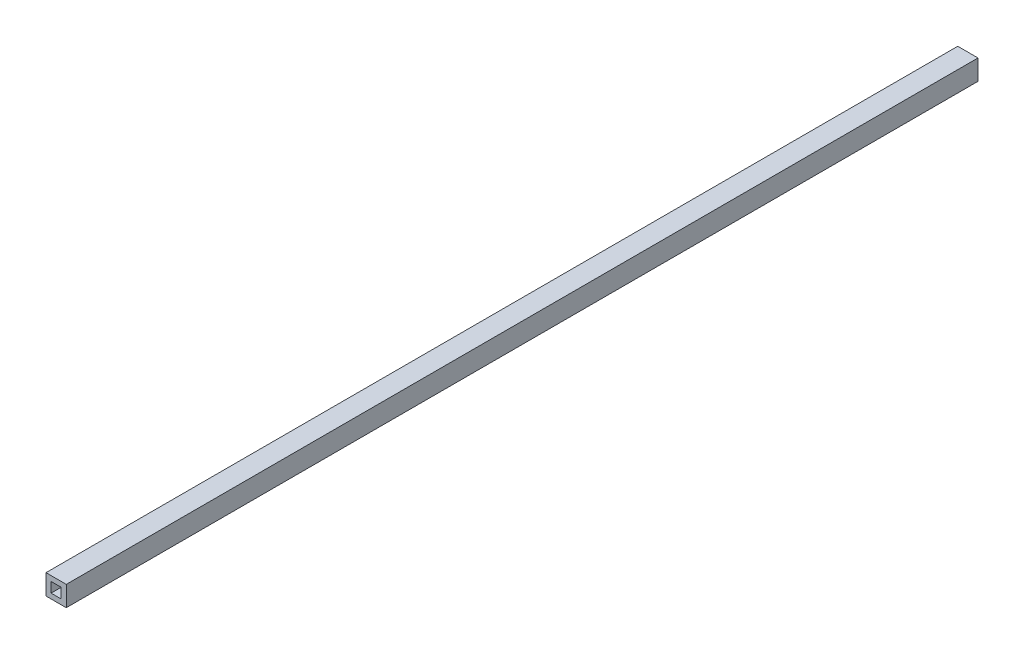
ISO-10303-21;
HEADER;
FILE_DESCRIPTION(('STEP AP214'),'2;1');
FILE_NAME('part.step','',(''),(''),'','','');
FILE_SCHEMA(('AUTOMOTIVE_DESIGN { 1 0 10303 214 1 1 1 1 }'));
ENDSEC;
DATA;
#1=APPLICATION_CONTEXT('core data for automotive mechanical design processes');
#2=APPLICATION_PROTOCOL_DEFINITION('international standard','automotive_design',2000,#1);
#3=PRODUCT_CONTEXT('',#1,'mechanical');
#4=PRODUCT('Part','Part','',(#3));
#5=PRODUCT_RELATED_PRODUCT_CATEGORY('part','',(#4));
#6=PRODUCT_DEFINITION_FORMATION('','',#4);
#7=PRODUCT_DEFINITION_CONTEXT('part definition',#1,'design');
#8=PRODUCT_DEFINITION('design','',#6,#7);
#9=PRODUCT_DEFINITION_SHAPE('','',#8);
#10=(LENGTH_UNIT() NAMED_UNIT(*) SI_UNIT(.MILLI.,.METRE.));
#11=(NAMED_UNIT(*) PLANE_ANGLE_UNIT() SI_UNIT($,.RADIAN.));
#12=(NAMED_UNIT(*) SI_UNIT($,.STERADIAN.) SOLID_ANGLE_UNIT());
#13=UNCERTAINTY_MEASURE_WITH_UNIT(LENGTH_MEASURE(1.E-05),#10,'distance_accuracy_value','');
#14=(GEOMETRIC_REPRESENTATION_CONTEXT(3) GLOBAL_UNCERTAINTY_ASSIGNED_CONTEXT((#13)) GLOBAL_UNIT_ASSIGNED_CONTEXT((#10,
#11,#12)) REPRESENTATION_CONTEXT('',''));
#15=CARTESIAN_POINT('',(0.,0.,0.));
#16=DIRECTION('',(0.,0.,1.));
#17=DIRECTION('',(1.,0.,0.));
#18=AXIS2_PLACEMENT_3D('',#15,#16,#17);
#19=CARTESIAN_POINT('',(0.,0.,900.));
#20=DIRECTION('',(0.,0.,1.));
#21=DIRECTION('',(1.,0.,0.));
#22=AXIS2_PLACEMENT_3D('',#19,#20,#21);
#23=PLANE('',#22);
#24=DIRECTION('',(0.,1.,0.));
#25=VECTOR('',#24,1.);
#26=CARTESIAN_POINT('',(10.,-10.,900.));
#27=LINE('',#26,#25);
#28=CARTESIAN_POINT('',(10.,-10.,900.));
#29=VERTEX_POINT('',#28);
#30=CARTESIAN_POINT('',(10.,10.,900.));
#31=VERTEX_POINT('',#30);
#32=EDGE_CURVE('E158',#29,#31,#27,.T.);
#33=ORIENTED_EDGE('',*,*,#32,.T.);
#34=DIRECTION('',(-1.,0.,0.));
#35=VECTOR('',#34,1.);
#36=CARTESIAN_POINT('',(-10.,10.,900.));
#37=LINE('',#36,#35);
#38=CARTESIAN_POINT('',(-10.,10.,900.));
#39=VERTEX_POINT('',#38);
#40=EDGE_CURVE('E161',#31,#39,#37,.T.);
#41=ORIENTED_EDGE('',*,*,#40,.T.);
#42=DIRECTION('',(0.,-1.,0.));
#43=VECTOR('',#42,1.);
#44=CARTESIAN_POINT('',(-10.,-10.,900.));
#45=LINE('',#44,#43);
#46=CARTESIAN_POINT('',(-10.,-10.,900.));
#47=VERTEX_POINT('',#46);
#48=EDGE_CURVE('E164',#39,#47,#45,.T.);
#49=ORIENTED_EDGE('',*,*,#48,.T.);
#50=DIRECTION('',(1.,0.,0.));
#51=VECTOR('',#50,1.);
#52=CARTESIAN_POINT('',(-10.,-10.,900.));
#53=LINE('',#52,#51);
#54=EDGE_CURVE('E166',#47,#29,#53,.T.);
#55=ORIENTED_EDGE('',*,*,#54,.T.);
#56=EDGE_LOOP('',(#33,#41,#49,#55));
#57=FACE_BOUND('',#56,.T.);
#58=DIRECTION('',(-1.,0.,0.));
#59=VECTOR('',#58,1.);
#60=CARTESIAN_POINT('',(0.,5.,900.));
#61=LINE('',#60,#59);
#62=CARTESIAN_POINT('',(5.,5.,900.));
#63=VERTEX_POINT('',#62);
#64=CARTESIAN_POINT('',(-5.,5.,900.));
#65=VERTEX_POINT('',#64);
#66=EDGE_CURVE('E130',#63,#65,#61,.T.);
#67=ORIENTED_EDGE('',*,*,#66,.F.);
#68=DIRECTION('',(0.,1.,0.));
#69=VECTOR('',#68,1.);
#70=CARTESIAN_POINT('',(5.,0.,900.));
#71=LINE('',#70,#69);
#72=CARTESIAN_POINT('',(5.,-5.,900.));
#73=VERTEX_POINT('',#72);
#74=EDGE_CURVE('E122',#73,#63,#71,.T.);
#75=ORIENTED_EDGE('',*,*,#74,.F.);
#76=DIRECTION('',(1.,0.,0.));
#77=VECTOR('',#76,1.);
#78=CARTESIAN_POINT('',(0.,-5.,900.));
#79=LINE('',#78,#77);
#80=CARTESIAN_POINT('',(-5.,-5.,900.));
#81=VERTEX_POINT('',#80);
#82=EDGE_CURVE('E144',#81,#73,#79,.T.);
#83=ORIENTED_EDGE('',*,*,#82,.F.);
#84=DIRECTION('',(0.,-1.,0.));
#85=VECTOR('',#84,1.);
#86=CARTESIAN_POINT('',(-5.,0.,900.));
#87=LINE('',#86,#85);
#88=EDGE_CURVE('E142',#65,#81,#87,.T.);
#89=ORIENTED_EDGE('',*,*,#88,.F.);
#90=EDGE_LOOP('',(#67,#75,#83,#89));
#91=FACE_BOUND('',#90,.T.);
#92=ADVANCED_FACE('F57',(#57,#91),#23,.T.);
#93=CARTESIAN_POINT('',(0.,0.,0.));
#94=DIRECTION('',(0.,0.,1.));
#95=DIRECTION('',(1.,0.,0.));
#96=AXIS2_PLACEMENT_3D('',#93,#94,#95);
#97=PLANE('',#96);
#98=DIRECTION('',(0.,1.,0.));
#99=VECTOR('',#98,1.);
#100=CARTESIAN_POINT('',(10.,-10.,0.));
#101=LINE('',#100,#99);
#102=CARTESIAN_POINT('',(10.,-10.,0.));
#103=VERTEX_POINT('',#102);
#104=CARTESIAN_POINT('',(10.,10.,0.));
#105=VERTEX_POINT('',#104);
#106=EDGE_CURVE('E138',#103,#105,#101,.T.);
#107=ORIENTED_EDGE('',*,*,#106,.F.);
#108=DIRECTION('',(1.,0.,0.));
#109=VECTOR('',#108,1.);
#110=CARTESIAN_POINT('',(-10.,-10.,0.));
#111=LINE('',#110,#109);
#112=CARTESIAN_POINT('',(-10.,-10.,0.));
#113=VERTEX_POINT('',#112);
#114=EDGE_CURVE('E162',#113,#103,#111,.T.);
#115=ORIENTED_EDGE('',*,*,#114,.F.);
#116=DIRECTION('',(0.,-1.,0.));
#117=VECTOR('',#116,1.);
#118=CARTESIAN_POINT('',(-10.,-10.,0.));
#119=LINE('',#118,#117);
#120=CARTESIAN_POINT('',(-10.,10.,0.));
#121=VERTEX_POINT('',#120);
#122=EDGE_CURVE('E173',#121,#113,#119,.T.);
#123=ORIENTED_EDGE('',*,*,#122,.F.);
#124=DIRECTION('',(-1.,0.,0.));
#125=VECTOR('',#124,1.);
#126=CARTESIAN_POINT('',(-10.,10.,0.));
#127=LINE('',#126,#125);
#128=EDGE_CURVE('E171',#105,#121,#127,.T.);
#129=ORIENTED_EDGE('',*,*,#128,.F.);
#130=EDGE_LOOP('',(#107,#115,#123,#129));
#131=FACE_BOUND('',#130,.T.);
#132=DIRECTION('',(0.,1.,0.));
#133=VECTOR('',#132,1.);
#134=CARTESIAN_POINT('',(5.,0.,0.));
#135=LINE('',#134,#133);
#136=CARTESIAN_POINT('',(5.,-5.,0.));
#137=VERTEX_POINT('',#136);
#138=CARTESIAN_POINT('',(5.,5.,0.));
#139=VERTEX_POINT('',#138);
#140=EDGE_CURVE('E80',#137,#139,#135,.T.);
#141=ORIENTED_EDGE('',*,*,#140,.T.);
#142=DIRECTION('',(-1.,0.,0.));
#143=VECTOR('',#142,1.);
#144=CARTESIAN_POINT('',(0.,5.,0.));
#145=LINE('',#144,#143);
#146=CARTESIAN_POINT('',(-5.,5.,0.));
#147=VERTEX_POINT('',#146);
#148=EDGE_CURVE('E137',#139,#147,#145,.T.);
#149=ORIENTED_EDGE('',*,*,#148,.T.);
#150=DIRECTION('',(0.,-1.,0.));
#151=VECTOR('',#150,1.);
#152=CARTESIAN_POINT('',(-5.,0.,0.));
#153=LINE('',#152,#151);
#154=CARTESIAN_POINT('',(-5.,-5.,0.));
#155=VERTEX_POINT('',#154);
#156=EDGE_CURVE('E150',#147,#155,#153,.T.);
#157=ORIENTED_EDGE('',*,*,#156,.T.);
#158=DIRECTION('',(1.,0.,0.));
#159=VECTOR('',#158,1.);
#160=CARTESIAN_POINT('',(0.,-5.,0.));
#161=LINE('',#160,#159);
#162=EDGE_CURVE('E131',#155,#137,#161,.T.);
#163=ORIENTED_EDGE('',*,*,#162,.T.);
#164=EDGE_LOOP('',(#141,#149,#157,#163));
#165=FACE_BOUND('',#164,.T.);
#166=ADVANCED_FACE('F191',(#131,#165),#97,.F.);
#167=CARTESIAN_POINT('',(10.,-10.,900.));
#168=DIRECTION('',(-1.,0.,0.));
#169=DIRECTION('',(0.,0.,1.));
#170=AXIS2_PLACEMENT_3D('',#167,#168,#169);
#171=PLANE('',#170);
#172=ORIENTED_EDGE('',*,*,#106,.T.);
#173=DIRECTION('',(0.,0.,-1.));
#174=VECTOR('',#173,1.);
#175=CARTESIAN_POINT('',(10.,10.,900.));
#176=LINE('',#175,#174);
#177=EDGE_CURVE('E12',#31,#105,#176,.T.);
#178=ORIENTED_EDGE('',*,*,#177,.F.);
#179=ORIENTED_EDGE('',*,*,#32,.F.);
#180=DIRECTION('',(0.,0.,-1.));
#181=VECTOR('',#180,1.);
#182=CARTESIAN_POINT('',(10.,-10.,900.));
#183=LINE('',#182,#181);
#184=EDGE_CURVE('E168',#29,#103,#183,.T.);
#185=ORIENTED_EDGE('',*,*,#184,.T.);
#186=EDGE_LOOP('',(#172,#178,#179,#185));
#187=FACE_BOUND('',#186,.T.);
#188=ADVANCED_FACE('F59',(#187),#171,.F.);
#189=CARTESIAN_POINT('',(-10.,10.,900.));
#190=DIRECTION('',(0.,-1.,0.));
#191=DIRECTION('',(0.,0.,-1.));
#192=AXIS2_PLACEMENT_3D('',#189,#190,#191);
#193=PLANE('',#192);
#194=ORIENTED_EDGE('',*,*,#128,.T.);
#195=DIRECTION('',(0.,0.,-1.));
#196=VECTOR('',#195,1.);
#197=CARTESIAN_POINT('',(-10.,10.,900.));
#198=LINE('',#197,#196);
#199=EDGE_CURVE('E65',#39,#121,#198,.T.);
#200=ORIENTED_EDGE('',*,*,#199,.F.);
#201=ORIENTED_EDGE('',*,*,#40,.F.);
#202=ORIENTED_EDGE('',*,*,#177,.T.);
#203=EDGE_LOOP('',(#194,#200,#201,#202));
#204=FACE_BOUND('',#203,.T.);
#205=ADVANCED_FACE('F201',(#204),#193,.F.);
#206=CARTESIAN_POINT('',(-10.,-10.,900.));
#207=DIRECTION('',(1.,0.,0.));
#208=DIRECTION('',(0.,0.,-1.));
#209=AXIS2_PLACEMENT_3D('',#206,#207,#208);
#210=PLANE('',#209);
#211=ORIENTED_EDGE('',*,*,#122,.T.);
#212=DIRECTION('',(0.,0.,-1.));
#213=VECTOR('',#212,1.);
#214=CARTESIAN_POINT('',(-10.,-10.,900.));
#215=LINE('',#214,#213);
#216=EDGE_CURVE('E178',#47,#113,#215,.T.);
#217=ORIENTED_EDGE('',*,*,#216,.F.);
#218=ORIENTED_EDGE('',*,*,#48,.F.);
#219=ORIENTED_EDGE('',*,*,#199,.T.);
#220=EDGE_LOOP('',(#211,#217,#218,#219));
#221=FACE_BOUND('',#220,.T.);
#222=ADVANCED_FACE('F185',(#221),#210,.F.);
#223=CARTESIAN_POINT('',(-10.,-10.,900.));
#224=DIRECTION('',(0.,1.,0.));
#225=DIRECTION('',(0.,0.,1.));
#226=AXIS2_PLACEMENT_3D('',#223,#224,#225);
#227=PLANE('',#226);
#228=ORIENTED_EDGE('',*,*,#114,.T.);
#229=ORIENTED_EDGE('',*,*,#184,.F.);
#230=ORIENTED_EDGE('',*,*,#54,.F.);
#231=ORIENTED_EDGE('',*,*,#216,.T.);
#232=EDGE_LOOP('',(#228,#229,#230,#231));
#233=FACE_BOUND('',#232,.T.);
#234=ADVANCED_FACE('F195',(#233),#227,.F.);
#235=CARTESIAN_POINT('',(5.,0.,900.));
#236=DIRECTION('',(-1.,0.,0.));
#237=DIRECTION('',(0.,0.,1.));
#238=AXIS2_PLACEMENT_3D('',#235,#236,#237);
#239=PLANE('',#238);
#240=ORIENTED_EDGE('',*,*,#140,.F.);
#241=DIRECTION('',(0.,0.,-1.));
#242=VECTOR('',#241,1.);
#243=CARTESIAN_POINT('',(5.,-5.,900.));
#244=LINE('',#243,#242);
#245=EDGE_CURVE('E126',#73,#137,#244,.T.);
#246=ORIENTED_EDGE('',*,*,#245,.F.);
#247=ORIENTED_EDGE('',*,*,#74,.T.);
#248=DIRECTION('',(0.,0.,-1.));
#249=VECTOR('',#248,1.);
#250=CARTESIAN_POINT('',(5.,5.,900.));
#251=LINE('',#250,#249);
#252=EDGE_CURVE('E125',#63,#139,#251,.T.);
#253=ORIENTED_EDGE('',*,*,#252,.T.);
#254=EDGE_LOOP('',(#240,#246,#247,#253));
#255=FACE_BOUND('',#254,.T.);
#256=ADVANCED_FACE('F124',(#255),#239,.T.);
#257=CARTESIAN_POINT('',(0.,5.,900.));
#258=DIRECTION('',(0.,-1.,0.));
#259=DIRECTION('',(0.,0.,-1.));
#260=AXIS2_PLACEMENT_3D('',#257,#258,#259);
#261=PLANE('',#260);
#262=ORIENTED_EDGE('',*,*,#148,.F.);
#263=ORIENTED_EDGE('',*,*,#252,.F.);
#264=ORIENTED_EDGE('',*,*,#66,.T.);
#265=DIRECTION('',(0.,0.,-1.));
#266=VECTOR('',#265,1.);
#267=CARTESIAN_POINT('',(-5.,5.,900.));
#268=LINE('',#267,#266);
#269=EDGE_CURVE('E139',#65,#147,#268,.T.);
#270=ORIENTED_EDGE('',*,*,#269,.T.);
#271=EDGE_LOOP('',(#262,#263,#264,#270));
#272=FACE_BOUND('',#271,.T.);
#273=ADVANCED_FACE('F134',(#272),#261,.T.);
#274=CARTESIAN_POINT('',(-5.,0.,900.));
#275=DIRECTION('',(1.,0.,0.));
#276=DIRECTION('',(0.,0.,-1.));
#277=AXIS2_PLACEMENT_3D('',#274,#275,#276);
#278=PLANE('',#277);
#279=ORIENTED_EDGE('',*,*,#156,.F.);
#280=ORIENTED_EDGE('',*,*,#269,.F.);
#281=ORIENTED_EDGE('',*,*,#88,.T.);
#282=DIRECTION('',(0.,0.,-1.));
#283=VECTOR('',#282,1.);
#284=CARTESIAN_POINT('',(-5.,-5.,900.));
#285=LINE('',#284,#283);
#286=EDGE_CURVE('E72',#81,#155,#285,.T.);
#287=ORIENTED_EDGE('',*,*,#286,.T.);
#288=EDGE_LOOP('',(#279,#280,#281,#287));
#289=FACE_BOUND('',#288,.T.);
#290=ADVANCED_FACE('F224',(#289),#278,.T.);
#291=CARTESIAN_POINT('',(0.,-5.,900.));
#292=DIRECTION('',(0.,1.,0.));
#293=DIRECTION('',(0.,0.,1.));
#294=AXIS2_PLACEMENT_3D('',#291,#292,#293);
#295=PLANE('',#294);
#296=ORIENTED_EDGE('',*,*,#162,.F.);
#297=ORIENTED_EDGE('',*,*,#286,.F.);
#298=ORIENTED_EDGE('',*,*,#82,.T.);
#299=ORIENTED_EDGE('',*,*,#245,.T.);
#300=EDGE_LOOP('',(#296,#297,#298,#299));
#301=FACE_BOUND('',#300,.T.);
#302=ADVANCED_FACE('F228',(#301),#295,.T.);
#303=CLOSED_SHELL('',(#92,#166,#188,#205,#222,#234,#256,#273,#290,#302));
#304=MANIFOLD_SOLID_BREP('B2',#303);
#305=ADVANCED_BREP_SHAPE_REPRESENTATION('',(#18,#304),#14);
#306=SHAPE_DEFINITION_REPRESENTATION(#9,#305);
ENDSEC;
END-ISO-10303-21;
